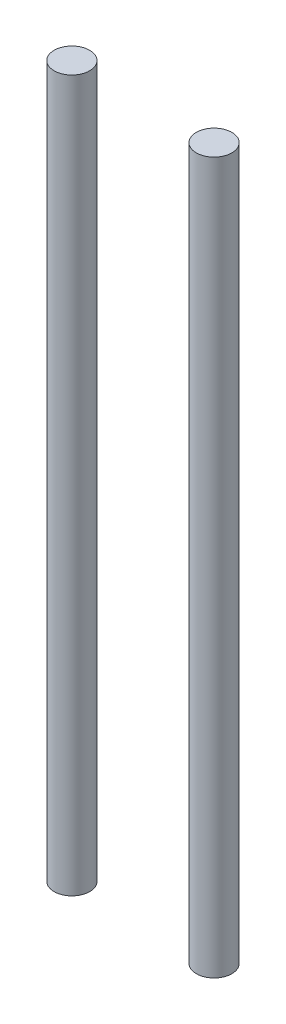
ISO-10303-21;
HEADER;
FILE_DESCRIPTION(('STEP AP214'),'2;1');
FILE_NAME('part.step','',(''),(''),'','','');
FILE_SCHEMA(('AUTOMOTIVE_DESIGN { 1 0 10303 214 1 1 1 1 }'));
ENDSEC;
DATA;
#1=APPLICATION_CONTEXT('core data for automotive mechanical design processes');
#2=APPLICATION_PROTOCOL_DEFINITION('international standard','automotive_design',2000,#1);
#3=PRODUCT_CONTEXT('',#1,'mechanical');
#4=PRODUCT('Part','Part','',(#3));
#5=PRODUCT_RELATED_PRODUCT_CATEGORY('part','',(#4));
#6=PRODUCT_DEFINITION_FORMATION('','',#4);
#7=PRODUCT_DEFINITION_CONTEXT('part definition',#1,'design');
#8=PRODUCT_DEFINITION('design','',#6,#7);
#9=PRODUCT_DEFINITION_SHAPE('','',#8);
#10=(LENGTH_UNIT() NAMED_UNIT(*) SI_UNIT(.MILLI.,.METRE.));
#11=(NAMED_UNIT(*) PLANE_ANGLE_UNIT() SI_UNIT($,.RADIAN.));
#12=(NAMED_UNIT(*) SI_UNIT($,.STERADIAN.) SOLID_ANGLE_UNIT());
#13=UNCERTAINTY_MEASURE_WITH_UNIT(LENGTH_MEASURE(1.E-05),#10,'distance_accuracy_value','');
#14=(GEOMETRIC_REPRESENTATION_CONTEXT(3) GLOBAL_UNCERTAINTY_ASSIGNED_CONTEXT((#13)) GLOBAL_UNIT_ASSIGNED_CONTEXT((#10,
#11,#12)) REPRESENTATION_CONTEXT('',''));
#15=CARTESIAN_POINT('',(0.,0.,0.));
#16=DIRECTION('',(0.,0.,1.));
#17=DIRECTION('',(1.,0.,0.));
#18=AXIS2_PLACEMENT_3D('',#15,#16,#17);
#19=CARTESIAN_POINT('',(50.,500.,0.));
#20=DIRECTION('',(0.,-1.,0.));
#21=DIRECTION('',(0.,0.,-1.));
#22=AXIS2_PLACEMENT_3D('',#19,#20,#21);
#23=CYLINDRICAL_SURFACE('',#22,12.5);
#24=CARTESIAN_POINT('',(50.,500.,0.));
#25=DIRECTION('',(0.,1.,0.));
#26=DIRECTION('',(0.,0.,1.));
#27=AXIS2_PLACEMENT_3D('',#24,#25,#26);
#28=CIRCLE('',#27,12.5);
#29=CARTESIAN_POINT('',(50.,500.,12.5));
#30=VERTEX_POINT('',#29);
#31=EDGE_CURVE('E51',#30,#30,#28,.T.);
#32=ORIENTED_EDGE('',*,*,#31,.F.);
#33=EDGE_LOOP('',(#32));
#34=FACE_BOUND('',#33,.T.);
#35=CARTESIAN_POINT('',(50.,0.,0.));
#36=DIRECTION('',(0.,1.,0.));
#37=DIRECTION('',(0.,0.,1.));
#38=AXIS2_PLACEMENT_3D('',#35,#36,#37);
#39=CIRCLE('',#38,12.5);
#40=CARTESIAN_POINT('',(50.,0.,12.5));
#41=VERTEX_POINT('',#40);
#42=EDGE_CURVE('E11',#41,#41,#39,.T.);
#43=ORIENTED_EDGE('',*,*,#42,.T.);
#44=EDGE_LOOP('',(#43));
#45=FACE_BOUND('',#44,.T.);
#46=ADVANCED_FACE('F47',(#34,#45),#23,.T.);
#47=CARTESIAN_POINT('',(50.,500.,0.));
#48=DIRECTION('',(0.,1.,0.));
#49=DIRECTION('',(0.,0.,1.));
#50=AXIS2_PLACEMENT_3D('',#47,#48,#49);
#51=PLANE('',#50);
#52=ORIENTED_EDGE('',*,*,#31,.T.);
#53=EDGE_LOOP('',(#52));
#54=FACE_BOUND('',#53,.T.);
#55=ADVANCED_FACE('F49',(#54),#51,.T.);
#56=CARTESIAN_POINT('',(50.,0.,0.));
#57=DIRECTION('',(0.,1.,0.));
#58=DIRECTION('',(0.,0.,1.));
#59=AXIS2_PLACEMENT_3D('',#56,#57,#58);
#60=PLANE('',#59);
#61=ORIENTED_EDGE('',*,*,#42,.F.);
#62=EDGE_LOOP('',(#61));
#63=FACE_BOUND('',#62,.T.);
#64=ADVANCED_FACE('F66',(#63),#60,.F.);
#65=CLOSED_SHELL('',(#46,#55,#64));
#66=MANIFOLD_SOLID_BREP('B2',#65);
#67=CARTESIAN_POINT('',(-50.,500.,0.));
#68=DIRECTION('',(0.,-1.,0.));
#69=DIRECTION('',(0.,0.,-1.));
#70=AXIS2_PLACEMENT_3D('',#67,#68,#69);
#71=CYLINDRICAL_SURFACE('',#70,12.5);
#72=CARTESIAN_POINT('',(-50.,500.,0.));
#73=DIRECTION('',(0.,1.,0.));
#74=DIRECTION('',(0.,0.,1.));
#75=AXIS2_PLACEMENT_3D('',#72,#73,#74);
#76=CIRCLE('',#75,12.5);
#77=CARTESIAN_POINT('',(-50.,500.,12.5));
#78=VERTEX_POINT('',#77);
#79=EDGE_CURVE('E46',#78,#78,#76,.T.);
#80=ORIENTED_EDGE('',*,*,#79,.F.);
#81=EDGE_LOOP('',(#80));
#82=FACE_BOUND('',#81,.T.);
#83=CARTESIAN_POINT('',(-50.,0.,0.));
#84=DIRECTION('',(0.,1.,0.));
#85=DIRECTION('',(0.,0.,1.));
#86=AXIS2_PLACEMENT_3D('',#83,#84,#85);
#87=CIRCLE('',#86,12.5);
#88=CARTESIAN_POINT('',(-50.,0.,12.5));
#89=VERTEX_POINT('',#88);
#90=EDGE_CURVE('E91',#89,#89,#87,.T.);
#91=ORIENTED_EDGE('',*,*,#90,.T.);
#92=EDGE_LOOP('',(#91));
#93=FACE_BOUND('',#92,.T.);
#94=ADVANCED_FACE('F88',(#82,#93),#71,.T.);
#95=CARTESIAN_POINT('',(-50.,500.,0.));
#96=DIRECTION('',(0.,1.,0.));
#97=DIRECTION('',(0.,0.,1.));
#98=AXIS2_PLACEMENT_3D('',#95,#96,#97);
#99=PLANE('',#98);
#100=ORIENTED_EDGE('',*,*,#79,.T.);
#101=EDGE_LOOP('',(#100));
#102=FACE_BOUND('',#101,.T.);
#103=ADVANCED_FACE('F103',(#102),#99,.T.);
#104=CARTESIAN_POINT('',(-50.,0.,0.));
#105=DIRECTION('',(0.,1.,0.));
#106=DIRECTION('',(0.,0.,1.));
#107=AXIS2_PLACEMENT_3D('',#104,#105,#106);
#108=PLANE('',#107);
#109=ORIENTED_EDGE('',*,*,#90,.F.);
#110=EDGE_LOOP('',(#109));
#111=FACE_BOUND('',#110,.T.);
#112=ADVANCED_FACE('F101',(#111),#108,.F.);
#113=CLOSED_SHELL('',(#94,#103,#112));
#114=MANIFOLD_SOLID_BREP('B6',#113);
#115=ADVANCED_BREP_SHAPE_REPRESENTATION('',(#18,#66,#114),#14);
#116=SHAPE_DEFINITION_REPRESENTATION(#9,#115);
ENDSEC;
END-ISO-10303-21;
